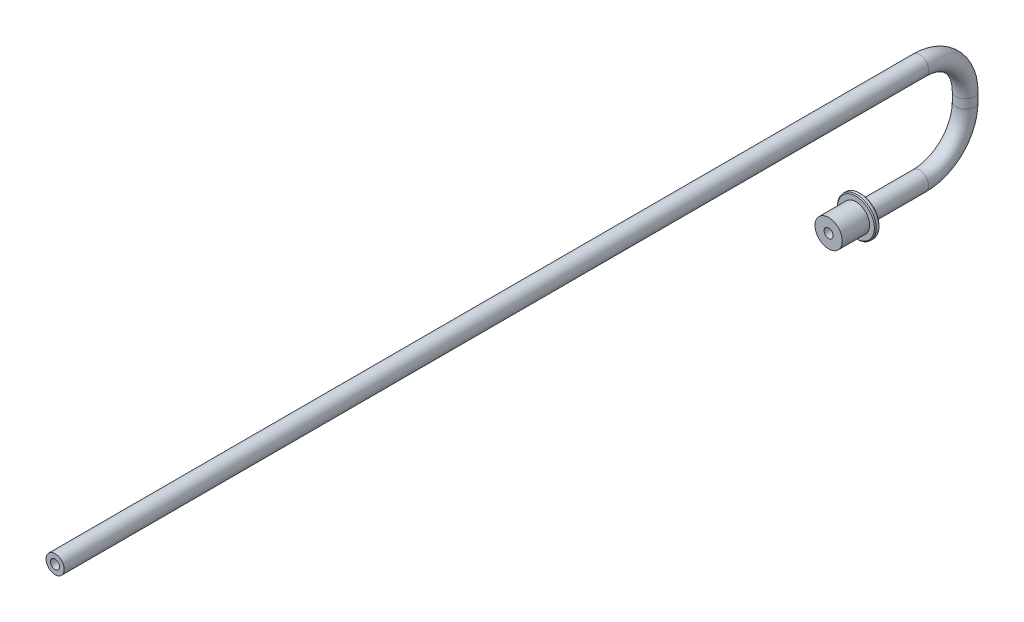
ISO-10303-21;
HEADER;
FILE_DESCRIPTION(('STEP AP214'),'2;1');
FILE_NAME('part.step','',(''),(''),'','','');
FILE_SCHEMA(('AUTOMOTIVE_DESIGN { 1 0 10303 214 1 1 1 1 }'));
ENDSEC;
DATA;
#1=APPLICATION_CONTEXT('core data for automotive mechanical design processes');
#2=APPLICATION_PROTOCOL_DEFINITION('international standard','automotive_design',2000,#1);
#3=PRODUCT_CONTEXT('',#1,'mechanical');
#4=PRODUCT('Part','Part','',(#3));
#5=PRODUCT_RELATED_PRODUCT_CATEGORY('part','',(#4));
#6=PRODUCT_DEFINITION_FORMATION('','',#4);
#7=PRODUCT_DEFINITION_CONTEXT('part definition',#1,'design');
#8=PRODUCT_DEFINITION('design','',#6,#7);
#9=PRODUCT_DEFINITION_SHAPE('','',#8);
#10=(LENGTH_UNIT() NAMED_UNIT(*) SI_UNIT(.MILLI.,.METRE.));
#11=(NAMED_UNIT(*) PLANE_ANGLE_UNIT() SI_UNIT($,.RADIAN.));
#12=(NAMED_UNIT(*) SI_UNIT($,.STERADIAN.) SOLID_ANGLE_UNIT());
#13=UNCERTAINTY_MEASURE_WITH_UNIT(LENGTH_MEASURE(1.E-05),#10,'distance_accuracy_value','');
#14=(GEOMETRIC_REPRESENTATION_CONTEXT(3) GLOBAL_UNCERTAINTY_ASSIGNED_CONTEXT((#13)) GLOBAL_UNIT_ASSIGNED_CONTEXT((#10,
#11,#12)) REPRESENTATION_CONTEXT('',''));
#15=CARTESIAN_POINT('',(0.,0.,0.));
#16=DIRECTION('',(0.,0.,1.));
#17=DIRECTION('',(1.,0.,0.));
#18=AXIS2_PLACEMENT_3D('',#15,#16,#17);
#19=CARTESIAN_POINT('',(0.,0.,1.));
#20=DIRECTION('',(0.,0.,-1.));
#21=DIRECTION('',(-1.,0.,0.));
#22=AXIS2_PLACEMENT_3D('',#19,#20,#21);
#23=CYLINDRICAL_SURFACE('',#22,4.25);
#24=CARTESIAN_POINT('',(0.,0.,0.799999999999999));
#25=DIRECTION('',(0.,0.,1.));
#26=DIRECTION('',(1.,0.,0.));
#27=AXIS2_PLACEMENT_3D('',#24,#25,#26);
#28=CIRCLE('',#27,4.25);
#29=CARTESIAN_POINT('',(4.25,0.,0.799999999999999));
#30=VERTEX_POINT('',#29);
#31=EDGE_CURVE('E58',#30,#30,#28,.F.);
#32=ORIENTED_EDGE('',*,*,#31,.T.);
#33=EDGE_LOOP('',(#32));
#34=FACE_BOUND('',#33,.T.);
#35=CARTESIAN_POINT('',(0.,0.,0.199999999999997));
#36=DIRECTION('',(0.,0.,1.));
#37=DIRECTION('',(1.,0.,0.));
#38=AXIS2_PLACEMENT_3D('',#35,#36,#37);
#39=CIRCLE('',#38,4.25);
#40=CARTESIAN_POINT('',(4.25,0.,0.199999999999997));
#41=VERTEX_POINT('',#40);
#42=EDGE_CURVE('E64',#41,#41,#39,.T.);
#43=ORIENTED_EDGE('',*,*,#42,.T.);
#44=EDGE_LOOP('',(#43));
#45=FACE_BOUND('',#44,.T.);
#46=ADVANCED_FACE('F39',(#34,#45),#23,.T.);
#47=CARTESIAN_POINT('',(0.,0.,1.));
#48=DIRECTION('',(0.,0.,1.));
#49=DIRECTION('',(1.,0.,0.));
#50=AXIS2_PLACEMENT_3D('',#47,#48,#49);
#51=PLANE('',#50);
#52=CARTESIAN_POINT('',(0.,0.,1.));
#53=DIRECTION('',(0.,0.,1.));
#54=DIRECTION('',(1.,0.,0.));
#55=AXIS2_PLACEMENT_3D('',#52,#53,#54);
#56=CIRCLE('',#55,4.05);
#57=CARTESIAN_POINT('',(4.05,0.,1.));
#58=VERTEX_POINT('',#57);
#59=EDGE_CURVE('E68',#58,#58,#56,.T.);
#60=ORIENTED_EDGE('',*,*,#59,.T.);
#61=EDGE_LOOP('',(#60));
#62=FACE_BOUND('',#61,.T.);
#63=CARTESIAN_POINT('',(0.,0.,1.));
#64=DIRECTION('',(0.,0.,1.));
#65=DIRECTION('',(1.,0.,0.));
#66=AXIS2_PLACEMENT_3D('',#63,#64,#65);
#67=CIRCLE('',#66,3.);
#68=CARTESIAN_POINT('',(3.,0.,1.));
#69=VERTEX_POINT('',#68);
#70=EDGE_CURVE('E72',#69,#69,#67,.T.);
#71=ORIENTED_EDGE('',*,*,#70,.F.);
#72=EDGE_LOOP('',(#71));
#73=FACE_BOUND('',#72,.T.);
#74=ADVANCED_FACE('F144',(#62,#73),#51,.T.);
#75=CARTESIAN_POINT('',(0.,0.,0.));
#76=DIRECTION('',(0.,0.,1.));
#77=DIRECTION('',(1.,0.,0.));
#78=AXIS2_PLACEMENT_3D('',#75,#76,#77);
#79=PLANE('',#78);
#80=CARTESIAN_POINT('',(0.,0.,0.));
#81=DIRECTION('',(0.,0.,1.));
#82=DIRECTION('',(1.,0.,0.));
#83=AXIS2_PLACEMENT_3D('',#80,#81,#82);
#84=CIRCLE('',#83,4.05);
#85=CARTESIAN_POINT('',(4.05,0.,0.));
#86=VERTEX_POINT('',#85);
#87=EDGE_CURVE('E48',#86,#86,#84,.F.);
#88=ORIENTED_EDGE('',*,*,#87,.T.);
#89=EDGE_LOOP('',(#88));
#90=FACE_BOUND('',#89,.T.);
#91=CARTESIAN_POINT('',(0.,0.,0.));
#92=DIRECTION('',(0.,0.,1.));
#93=DIRECTION('',(1.,0.,0.));
#94=AXIS2_PLACEMENT_3D('',#91,#92,#93);
#95=CIRCLE('',#94,2.2);
#96=CARTESIAN_POINT('',(2.2,0.,0.));
#97=VERTEX_POINT('',#96);
#98=EDGE_CURVE('E53',#97,#97,#95,.T.);
#99=ORIENTED_EDGE('',*,*,#98,.T.);
#100=EDGE_LOOP('',(#99));
#101=FACE_BOUND('',#100,.T.);
#102=ADVANCED_FACE('F150',(#90,#101),#79,.F.);
#103=CARTESIAN_POINT('',(0.,0.,7.));
#104=DIRECTION('',(0.,0.,-1.));
#105=DIRECTION('',(-1.,0.,0.));
#106=AXIS2_PLACEMENT_3D('',#103,#104,#105);
#107=CYLINDRICAL_SURFACE('',#106,3.);
#108=CARTESIAN_POINT('',(0.,0.,7.));
#109=DIRECTION('',(0.,0.,1.));
#110=DIRECTION('',(1.,0.,0.));
#111=AXIS2_PLACEMENT_3D('',#108,#109,#110);
#112=CIRCLE('',#111,3.);
#113=CARTESIAN_POINT('',(3.,0.,7.));
#114=VERTEX_POINT('',#113);
#115=EDGE_CURVE('E76',#114,#114,#112,.T.);
#116=ORIENTED_EDGE('',*,*,#115,.F.);
#117=EDGE_LOOP('',(#116));
#118=FACE_BOUND('',#117,.T.);
#119=ORIENTED_EDGE('',*,*,#70,.T.);
#120=EDGE_LOOP('',(#119));
#121=FACE_BOUND('',#120,.T.);
#122=ADVANCED_FACE('F211',(#118,#121),#107,.T.);
#123=CARTESIAN_POINT('',(0.,0.,7.));
#124=DIRECTION('',(0.,0.,1.));
#125=DIRECTION('',(1.,0.,0.));
#126=AXIS2_PLACEMENT_3D('',#123,#124,#125);
#127=PLANE('',#126);
#128=ORIENTED_EDGE('',*,*,#115,.T.);
#129=EDGE_LOOP('',(#128));
#130=FACE_BOUND('',#129,.T.);
#131=CARTESIAN_POINT('',(0.,0.,7.));
#132=DIRECTION('',(0.,0.,1.));
#133=DIRECTION('',(1.,0.,0.));
#134=AXIS2_PLACEMENT_3D('',#131,#132,#133);
#135=CIRCLE('',#134,1.);
#136=CARTESIAN_POINT('',(1.,0.,7.));
#137=VERTEX_POINT('',#136);
#138=EDGE_CURVE('E101',#137,#137,#135,.F.);
#139=ORIENTED_EDGE('',*,*,#138,.T.);
#140=EDGE_LOOP('',(#139));
#141=FACE_BOUND('',#140,.T.);
#142=ADVANCED_FACE('F125',(#130,#141),#127,.T.);
#143=CARTESIAN_POINT('',(0.,0.,1.));
#144=DIRECTION('',(0.,0.,-1.));
#145=DIRECTION('',(-1.,0.,0.));
#146=AXIS2_PLACEMENT_3D('',#143,#144,#145);
#147=CONICAL_SURFACE('',#146,4.05,0.785398163397448);
#148=ORIENTED_EDGE('',*,*,#31,.F.);
#149=EDGE_LOOP('',(#148));
#150=FACE_BOUND('',#149,.T.);
#151=ORIENTED_EDGE('',*,*,#59,.F.);
#152=EDGE_LOOP('',(#151));
#153=FACE_BOUND('',#152,.T.);
#154=ADVANCED_FACE('F157',(#150,#153),#147,.T.);
#155=CARTESIAN_POINT('',(0.,0.,0.199999999999997));
#156=DIRECTION('',(0.,0.,1.));
#157=DIRECTION('',(1.,0.,0.));
#158=AXIS2_PLACEMENT_3D('',#155,#156,#157);
#159=CONICAL_SURFACE('',#158,4.25,0.785398163397448);
#160=ORIENTED_EDGE('',*,*,#87,.F.);
#161=EDGE_LOOP('',(#160));
#162=FACE_BOUND('',#161,.T.);
#163=ORIENTED_EDGE('',*,*,#42,.F.);
#164=EDGE_LOOP('',(#163));
#165=FACE_BOUND('',#164,.T.);
#166=ADVANCED_FACE('F162',(#162,#165),#159,.T.);
#167=CARTESIAN_POINT('',(0.,0.,0.200000000000001));
#168=DIRECTION('',(0.,0.,-1.));
#169=DIRECTION('',(-1.,0.,0.));
#170=AXIS2_PLACEMENT_3D('',#167,#168,#169);
#171=CONICAL_SURFACE('',#170,2.,0.785398163397448);
#172=ORIENTED_EDGE('',*,*,#98,.F.);
#173=EDGE_LOOP('',(#172));
#174=FACE_BOUND('',#173,.T.);
#175=CARTESIAN_POINT('',(0.,0.,0.200000000000001));
#176=DIRECTION('',(0.,0.,1.));
#177=DIRECTION('',(1.,0.,0.));
#178=AXIS2_PLACEMENT_3D('',#175,#176,#177);
#179=CIRCLE('',#178,2.);
#180=CARTESIAN_POINT('',(2.,0.,0.200000000000001));
#181=VERTEX_POINT('',#180);
#182=EDGE_CURVE('E10',#181,#181,#179,.F.);
#183=ORIENTED_EDGE('',*,*,#182,.F.);
#184=EDGE_LOOP('',(#183));
#185=FACE_BOUND('',#184,.T.);
#186=ADVANCED_FACE('F42',(#174,#185),#171,.F.);
#187=CARTESIAN_POINT('',(0.,0.,7.));
#188=DIRECTION('',(0.,0.,-1.));
#189=DIRECTION('',(-1.,0.,0.));
#190=AXIS2_PLACEMENT_3D('',#187,#188,#189);
#191=CYLINDRICAL_SURFACE('',#190,2.);
#192=ORIENTED_EDGE('',*,*,#182,.T.);
#193=EDGE_LOOP('',(#192));
#194=FACE_BOUND('',#193,.T.);
#195=CARTESIAN_POINT('',(0.,0.,-12.9999999999999));
#196=DIRECTION('',(0.,0.,1.));
#197=DIRECTION('',(1.,0.,0.));
#198=AXIS2_PLACEMENT_3D('',#195,#196,#197);
#199=CIRCLE('',#198,2.);
#200=CARTESIAN_POINT('',(0.,-2.00000000000005,-12.9999999999999));
#201=VERTEX_POINT('',#200);
#202=EDGE_CURVE('E94',#201,#201,#199,.T.);
#203=ORIENTED_EDGE('',*,*,#202,.T.);
#204=EDGE_LOOP('',(#203));
#205=FACE_BOUND('',#204,.T.);
#206=ADVANCED_FACE('F171',(#194,#205),#191,.T.);
#207=CARTESIAN_POINT('',(0.,10.,-13.));
#208=DIRECTION('',(1.,0.,0.));
#209=DIRECTION('',(0.,0.,-1.));
#210=AXIS2_PLACEMENT_3D('',#207,#208,#209);
#211=TOROIDAL_SURFACE('',#210,10.,2.);
#212=CARTESIAN_POINT('',(0.,10.,-23.));
#213=DIRECTION('',(0.,-1.,0.));
#214=DIRECTION('',(1.,0.,0.));
#215=AXIS2_PLACEMENT_3D('',#212,#213,#214);
#216=CIRCLE('',#215,2.);
#217=CARTESIAN_POINT('',(0.,10.,-25.));
#218=VERTEX_POINT('',#217);
#219=EDGE_CURVE('E90',#218,#218,#216,.T.);
#220=CARTESIAN_POINT('',(0.,10.,-13.));
#221=DIRECTION('',(1.,0.,0.));
#222=DIRECTION('',(0.,0.,-1.));
#223=AXIS2_PLACEMENT_3D('',#220,#221,#222);
#224=CIRCLE('',#223,12.);
#225=EDGE_CURVE('',#201,#218,#224,.T.);
#226=ORIENTED_EDGE('',*,*,#202,.F.);
#227=ORIENTED_EDGE('',*,*,#219,.T.);
#228=ORIENTED_EDGE('',*,*,#225,.T.);
#229=ORIENTED_EDGE('',*,*,#225,.F.);
#230=EDGE_LOOP('',(#226,#228,#227,#229));
#231=FACE_BOUND('',#230,.T.);
#232=ADVANCED_FACE('F179',(#231),#211,.T.);
#233=CARTESIAN_POINT('',(0.,10.,-23.));
#234=DIRECTION('',(0.,1.,0.));
#235=DIRECTION('',(0.,0.,1.));
#236=AXIS2_PLACEMENT_3D('',#233,#234,#235);
#237=CYLINDRICAL_SURFACE('',#236,2.);
#238=CARTESIAN_POINT('',(0.,12.,-23.));
#239=DIRECTION('',(0.,-1.,0.));
#240=DIRECTION('',(1.,0.,0.));
#241=AXIS2_PLACEMENT_3D('',#238,#239,#240);
#242=CIRCLE('',#241,2.);
#243=CARTESIAN_POINT('',(0.,12.,-25.));
#244=VERTEX_POINT('',#243);
#245=EDGE_CURVE('E86',#244,#244,#242,.T.);
#246=ORIENTED_EDGE('',*,*,#245,.T.);
#247=EDGE_LOOP('',(#246));
#248=FACE_BOUND('',#247,.T.);
#249=ORIENTED_EDGE('',*,*,#219,.F.);
#250=EDGE_LOOP('',(#249));
#251=FACE_BOUND('',#250,.T.);
#252=ADVANCED_FACE('F197',(#248,#251),#237,.T.);
#253=CARTESIAN_POINT('',(0.,12.,-13.));
#254=DIRECTION('',(1.,0.,0.));
#255=DIRECTION('',(0.,0.,-1.));
#256=AXIS2_PLACEMENT_3D('',#253,#254,#255);
#257=TOROIDAL_SURFACE('',#256,10.,2.);
#258=CARTESIAN_POINT('',(0.,22.,-13.));
#259=DIRECTION('',(0.,0.,-1.));
#260=DIRECTION('',(1.,0.,0.));
#261=AXIS2_PLACEMENT_3D('',#258,#259,#260);
#262=CIRCLE('',#261,2.);
#263=CARTESIAN_POINT('',(0.,24.,-13.));
#264=VERTEX_POINT('',#263);
#265=EDGE_CURVE('E81',#264,#264,#262,.T.);
#266=CARTESIAN_POINT('',(0.,12.,-13.));
#267=DIRECTION('',(1.,0.,0.));
#268=DIRECTION('',(0.,0.,-1.));
#269=AXIS2_PLACEMENT_3D('',#266,#267,#268);
#270=CIRCLE('',#269,12.);
#271=EDGE_CURVE('',#244,#264,#270,.T.);
#272=ORIENTED_EDGE('',*,*,#245,.F.);
#273=ORIENTED_EDGE('',*,*,#265,.T.);
#274=ORIENTED_EDGE('',*,*,#271,.T.);
#275=ORIENTED_EDGE('',*,*,#271,.F.);
#276=EDGE_LOOP('',(#272,#274,#273,#275));
#277=FACE_BOUND('',#276,.T.);
#278=ADVANCED_FACE('F201',(#277),#257,.T.);
#279=CARTESIAN_POINT('',(0.,22.,-13.));
#280=DIRECTION('',(0.,0.,1.));
#281=DIRECTION('',(0.,-1.,0.));
#282=AXIS2_PLACEMENT_3D('',#279,#280,#281);
#283=CYLINDRICAL_SURFACE('',#282,2.);
#284=CARTESIAN_POINT('',(0.,22.,177.));
#285=DIRECTION('',(0.,0.,-1.));
#286=DIRECTION('',(1.,0.,0.));
#287=AXIS2_PLACEMENT_3D('',#284,#285,#286);
#288=CIRCLE('',#287,2.);
#289=CARTESIAN_POINT('',(2.,22.,177.));
#290=VERTEX_POINT('',#289);
#291=EDGE_CURVE('E85',#290,#290,#288,.T.);
#292=ORIENTED_EDGE('',*,*,#291,.T.);
#293=EDGE_LOOP('',(#292));
#294=FACE_BOUND('',#293,.T.);
#295=ORIENTED_EDGE('',*,*,#265,.F.);
#296=EDGE_LOOP('',(#295));
#297=FACE_BOUND('',#296,.T.);
#298=ADVANCED_FACE('F140',(#294,#297),#283,.T.);
#299=CARTESIAN_POINT('',(0.,22.,177.));
#300=DIRECTION('',(0.,0.,-1.));
#301=DIRECTION('',(1.,0.,0.));
#302=AXIS2_PLACEMENT_3D('',#299,#300,#301);
#303=PLANE('',#302);
#304=CARTESIAN_POINT('',(0.,22.,177.));
#305=DIRECTION('',(0.,0.,-1.));
#306=DIRECTION('',(1.,0.,0.));
#307=AXIS2_PLACEMENT_3D('',#304,#305,#306);
#308=CIRCLE('',#307,1.);
#309=CARTESIAN_POINT('',(1.,22.,177.));
#310=VERTEX_POINT('',#309);
#311=EDGE_CURVE('E80',#310,#310,#308,.F.);
#312=ORIENTED_EDGE('',*,*,#311,.F.);
#313=EDGE_LOOP('',(#312));
#314=FACE_BOUND('',#313,.T.);
#315=ORIENTED_EDGE('',*,*,#291,.F.);
#316=EDGE_LOOP('',(#315));
#317=FACE_BOUND('',#316,.T.);
#318=ADVANCED_FACE('F130',(#314,#317),#303,.F.);
#319=CARTESIAN_POINT('',(0.,0.,7.));
#320=DIRECTION('',(0.,0.,-1.));
#321=DIRECTION('',(-1.,0.,0.));
#322=AXIS2_PLACEMENT_3D('',#319,#320,#321);
#323=CYLINDRICAL_SURFACE('',#322,1.);
#324=CARTESIAN_POINT('',(0.,0.,-12.9999999999999));
#325=DIRECTION('',(0.,0.,1.));
#326=DIRECTION('',(1.,0.,0.));
#327=AXIS2_PLACEMENT_3D('',#324,#325,#326);
#328=CIRCLE('',#327,1.);
#329=CARTESIAN_POINT('',(0.,-1.00000000000005,-12.9999999999999));
#330=VERTEX_POINT('',#329);
#331=EDGE_CURVE('E117',#330,#330,#328,.F.);
#332=ORIENTED_EDGE('',*,*,#331,.T.);
#333=EDGE_LOOP('',(#332));
#334=FACE_BOUND('',#333,.T.);
#335=ORIENTED_EDGE('',*,*,#138,.F.);
#336=EDGE_LOOP('',(#335));
#337=FACE_BOUND('',#336,.T.);
#338=ADVANCED_FACE('F127',(#334,#337),#323,.F.);
#339=CARTESIAN_POINT('',(0.,10.,-13.));
#340=DIRECTION('',(1.,0.,0.));
#341=DIRECTION('',(0.,0.,-1.));
#342=AXIS2_PLACEMENT_3D('',#339,#340,#341);
#343=TOROIDAL_SURFACE('',#342,10.,1.);
#344=CARTESIAN_POINT('',(0.,10.,-23.));
#345=DIRECTION('',(0.,-1.,0.));
#346=DIRECTION('',(1.,0.,0.));
#347=AXIS2_PLACEMENT_3D('',#344,#345,#346);
#348=CIRCLE('',#347,1.);
#349=CARTESIAN_POINT('',(0.,10.,-24.));
#350=VERTEX_POINT('',#349);
#351=EDGE_CURVE('E113',#350,#350,#348,.F.);
#352=CARTESIAN_POINT('',(0.,10.,-13.));
#353=DIRECTION('',(1.,0.,0.));
#354=DIRECTION('',(0.,0.,-1.));
#355=AXIS2_PLACEMENT_3D('',#352,#353,#354);
#356=CIRCLE('',#355,11.);
#357=EDGE_CURVE('',#330,#350,#356,.T.);
#358=ORIENTED_EDGE('',*,*,#331,.F.);
#359=ORIENTED_EDGE('',*,*,#351,.T.);
#360=ORIENTED_EDGE('',*,*,#357,.T.);
#361=ORIENTED_EDGE('',*,*,#357,.F.);
#362=EDGE_LOOP('',(#358,#360,#359,#361));
#363=FACE_BOUND('',#362,.T.);
#364=ADVANCED_FACE('F129',(#363),#343,.F.);
#365=CARTESIAN_POINT('',(0.,10.,-23.));
#366=DIRECTION('',(0.,1.,0.));
#367=DIRECTION('',(0.,0.,1.));
#368=AXIS2_PLACEMENT_3D('',#365,#366,#367);
#369=CYLINDRICAL_SURFACE('',#368,1.);
#370=CARTESIAN_POINT('',(0.,12.,-23.));
#371=DIRECTION('',(0.,-1.,0.));
#372=DIRECTION('',(1.,0.,0.));
#373=AXIS2_PLACEMENT_3D('',#370,#371,#372);
#374=CIRCLE('',#373,1.);
#375=CARTESIAN_POINT('',(0.,12.,-24.));
#376=VERTEX_POINT('',#375);
#377=EDGE_CURVE('E109',#376,#376,#374,.F.);
#378=ORIENTED_EDGE('',*,*,#377,.T.);
#379=EDGE_LOOP('',(#378));
#380=FACE_BOUND('',#379,.T.);
#381=ORIENTED_EDGE('',*,*,#351,.F.);
#382=EDGE_LOOP('',(#381));
#383=FACE_BOUND('',#382,.T.);
#384=ADVANCED_FACE('F137',(#380,#383),#369,.F.);
#385=CARTESIAN_POINT('',(0.,12.,-13.));
#386=DIRECTION('',(1.,0.,0.));
#387=DIRECTION('',(0.,0.,-1.));
#388=AXIS2_PLACEMENT_3D('',#385,#386,#387);
#389=TOROIDAL_SURFACE('',#388,10.,1.);
#390=CARTESIAN_POINT('',(0.,22.,-13.));
#391=DIRECTION('',(0.,0.,-1.));
#392=DIRECTION('',(1.,0.,0.));
#393=AXIS2_PLACEMENT_3D('',#390,#391,#392);
#394=CIRCLE('',#393,1.);
#395=CARTESIAN_POINT('',(0.,23.,-13.));
#396=VERTEX_POINT('',#395);
#397=EDGE_CURVE('E105',#396,#396,#394,.F.);
#398=CARTESIAN_POINT('',(0.,12.,-13.));
#399=DIRECTION('',(1.,0.,0.));
#400=DIRECTION('',(0.,0.,-1.));
#401=AXIS2_PLACEMENT_3D('',#398,#399,#400);
#402=CIRCLE('',#401,11.);
#403=EDGE_CURVE('',#376,#396,#402,.T.);
#404=ORIENTED_EDGE('',*,*,#377,.F.);
#405=ORIENTED_EDGE('',*,*,#397,.T.);
#406=ORIENTED_EDGE('',*,*,#403,.T.);
#407=ORIENTED_EDGE('',*,*,#403,.F.);
#408=EDGE_LOOP('',(#404,#406,#405,#407));
#409=FACE_BOUND('',#408,.T.);
#410=ADVANCED_FACE('F184',(#409),#389,.F.);
#411=CARTESIAN_POINT('',(0.,22.,-13.));
#412=DIRECTION('',(0.,0.,1.));
#413=DIRECTION('',(0.,-1.,0.));
#414=AXIS2_PLACEMENT_3D('',#411,#412,#413);
#415=CYLINDRICAL_SURFACE('',#414,1.);
#416=ORIENTED_EDGE('',*,*,#311,.T.);
#417=EDGE_LOOP('',(#416));
#418=FACE_BOUND('',#417,.T.);
#419=ORIENTED_EDGE('',*,*,#397,.F.);
#420=EDGE_LOOP('',(#419));
#421=FACE_BOUND('',#420,.T.);
#422=ADVANCED_FACE('F173',(#418,#421),#415,.F.);
#423=CLOSED_SHELL('',(#46,#74,#102,#122,#142,#154,#166,#186,#206,#232,#252,#278,#298,#318,#338,
#364,#384,#410,#422));
#424=MANIFOLD_SOLID_BREP('B2',#423);
#425=ADVANCED_BREP_SHAPE_REPRESENTATION('',(#18,#424),#14);
#426=SHAPE_DEFINITION_REPRESENTATION(#9,#425);
ENDSEC;
END-ISO-10303-21;
